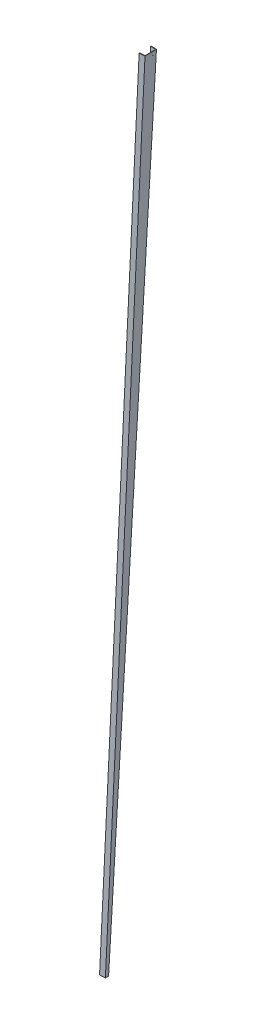
ISO-10303-21;
HEADER;
FILE_DESCRIPTION(('STEP AP214'),'2;1');
FILE_NAME('part.step','',(''),(''),'','','');
FILE_SCHEMA(('AUTOMOTIVE_DESIGN { 1 0 10303 214 1 1 1 1 }'));
ENDSEC;
DATA;
#1=APPLICATION_CONTEXT('core data for automotive mechanical design processes');
#2=APPLICATION_PROTOCOL_DEFINITION('international standard','automotive_design',2000,#1);
#3=PRODUCT_CONTEXT('',#1,'mechanical');
#4=PRODUCT('Part','Part','',(#3));
#5=PRODUCT_RELATED_PRODUCT_CATEGORY('part','',(#4));
#6=PRODUCT_DEFINITION_FORMATION('','',#4);
#7=PRODUCT_DEFINITION_CONTEXT('part definition',#1,'design');
#8=PRODUCT_DEFINITION('design','',#6,#7);
#9=PRODUCT_DEFINITION_SHAPE('','',#8);
#10=(LENGTH_UNIT() NAMED_UNIT(*) SI_UNIT(.MILLI.,.METRE.));
#11=(NAMED_UNIT(*) PLANE_ANGLE_UNIT() SI_UNIT($,.RADIAN.));
#12=(NAMED_UNIT(*) SI_UNIT($,.STERADIAN.) SOLID_ANGLE_UNIT());
#13=UNCERTAINTY_MEASURE_WITH_UNIT(LENGTH_MEASURE(1.E-05),#10,'distance_accuracy_value','');
#14=(GEOMETRIC_REPRESENTATION_CONTEXT(3) GLOBAL_UNCERTAINTY_ASSIGNED_CONTEXT((#13)) GLOBAL_UNIT_ASSIGNED_CONTEXT((#10,
#11,#12)) REPRESENTATION_CONTEXT('',''));
#15=CARTESIAN_POINT('',(0.,0.,0.));
#16=DIRECTION('',(0.,0.,1.));
#17=DIRECTION('',(1.,0.,0.));
#18=AXIS2_PLACEMENT_3D('',#15,#16,#17);
#19=CARTESIAN_POINT('',(2599.99999999952,-6.,170.586848034612));
#20=CARTESIAN_POINT('',(2534.2697041529,-6.,176.346834132));
#21=CARTESIAN_POINT('',(2334.95316217575,-6.,192.748824658086));
#22=CARTESIAN_POINT('',(2001.69070181506,-6.,214.463613492604));
#23=CARTESIAN_POINT('',(1599.37094286474,-6.,231.352561723895));
#24=CARTESIAN_POINT('',(1263.24435445069,-6.,232.556225070545));
#25=CARTESIAN_POINT('',(993.973907409277,-6.,222.12375768287));
#26=CARTESIAN_POINT('',(795.174235232141,-6.,208.219874651518));
#27=CARTESIAN_POINT('',(663.965855088083,-6.,194.360823975463));
#28=CARTESIAN_POINT('',(600.,-6.,186.18428191945));
#29=B_SPLINE_CURVE_WITH_KNOTS('',3,(#19,#20,#21,#22,#23,#24,#25,#26,#27,#28),.UNSPECIFIED.,.F.,
.F.,(4,1,1,1,1,1,1,4),(0.174597883746009,0.199092181037773,0.248838608700846,0.298568063520415,
0.348560819140765,0.373566506187247,0.398590699494546,0.422530238981498),.UNSPECIFIED.);
#30=DIRECTION('',(0.,1.,0.));
#31=VECTOR('',#30,1.);
#32=SURFACE_OF_LINEAR_EXTRUSION('',#29,#31);
#33=CARTESIAN_POINT('',(2599.99999999952,0.,170.586848034612));
#34=CARTESIAN_POINT('',(2534.2697041529,0.,176.346834132));
#35=CARTESIAN_POINT('',(2334.95316217575,0.,192.748824658086));
#36=CARTESIAN_POINT('',(2001.69070181506,0.,214.463613492604));
#37=CARTESIAN_POINT('',(1599.37094286474,0.,231.352561723895));
#38=CARTESIAN_POINT('',(1263.24435445069,0.,232.556225070545));
#39=CARTESIAN_POINT('',(993.973907409277,0.,222.12375768287));
#40=CARTESIAN_POINT('',(795.174235232141,0.,208.219874651518));
#41=CARTESIAN_POINT('',(663.965855088083,0.,194.360823975463));
#42=CARTESIAN_POINT('',(600.,0.,186.18428191945));
#43=B_SPLINE_CURVE_WITH_KNOTS('',3,(#33,#34,#35,#36,#37,#38,#39,#40,#41,#42),.UNSPECIFIED.,.F.,
.F.,(4,1,1,1,1,1,1,4),(0.174597883746009,0.199092181037773,0.248838608700846,0.298568063520415,
0.348560819140765,0.373566506187247,0.398590699494546,0.422530238981498),.UNSPECIFIED.);
#44=CARTESIAN_POINT('',(2599.99999999952,0.,170.586848034612));
#45=VERTEX_POINT('',#44);
#46=CARTESIAN_POINT('',(2500.35850650668,0.,179.046917450204));
#47=VERTEX_POINT('',#46);
#48=EDGE_CURVE('E269',#45,#47,#43,.T.);
#49=ORIENTED_EDGE('',*,*,#48,.T.);
#50=DIRECTION('',(0.,1.,0.));
#51=VECTOR('',#50,1.);
#52=CARTESIAN_POINT('',(2500.35850650668,-6.,179.046917450204));
#53=LINE('',#52,#51);
#54=CARTESIAN_POINT('',(2500.35850650668,-6.,179.046917450204));
#55=VERTEX_POINT('',#54);
#56=EDGE_CURVE('E12',#55,#47,#53,.T.);
#57=ORIENTED_EDGE('',*,*,#56,.F.);
#58=CARTESIAN_POINT('',(2599.99999999952,-6.,170.586848034612));
#59=CARTESIAN_POINT('',(2579.45955608785,-6.,172.386819719532));
#60=CARTESIAN_POINT('',(2546.2485958408,-6.,175.24168460526));
#61=CARTESIAN_POINT('',(2513.03004420894,-6.,178.005908476496));
#62=CARTESIAN_POINT('',(2500.35850650668,-6.,179.046917450204));
#63=B_SPLINE_CURVE_WITH_KNOTS('',3,(#58,#59,#60,#61,#62),.UNSPECIFIED.,.F.,.F.,(4,1,4),(0.,
0.618573156382193,1.),.UNSPECIFIED.);
#64=CARTESIAN_POINT('',(2599.99999999952,-6.,170.586848034612));
#65=VERTEX_POINT('',#64);
#66=EDGE_CURVE('E366',#65,#55,#63,.T.);
#67=ORIENTED_EDGE('',*,*,#66,.F.);
#68=DIRECTION('',(0.,1.,0.));
#69=VECTOR('',#68,1.);
#70=CARTESIAN_POINT('',(2599.99999999952,-6.,170.586848034612));
#71=LINE('',#70,#69);
#72=EDGE_CURVE('E504',#65,#45,#71,.T.);
#73=ORIENTED_EDGE('',*,*,#72,.T.);
#74=EDGE_LOOP('',(#49,#57,#67,#73));
#75=FACE_BOUND('',#74,.T.);
#76=ADVANCED_FACE('F83',(#75),#32,.F.);
#77=CARTESIAN_POINT('',(2468.98560541185,-6.,-202.835380486657));
#78=DIRECTION('',(0.996642401697206,0.,-0.0818774885986695));
#79=DIRECTION('',(-0.0818774885986695,0.,-0.996642401697206));
#80=AXIS2_PLACEMENT_3D('',#77,#78,#79);
#81=PLANE('',#80);
#82=DIRECTION('',(-0.0818774885986695,0.,-0.996642401697206));
#83=VECTOR('',#82,1.);
#84=CARTESIAN_POINT('',(2468.98560541185,0.,-202.835380486657));
#85=LINE('',#84,#83);
#86=CARTESIAN_POINT('',(2499.70348659789,0.,171.073778236626));
#87=VERTEX_POINT('',#86);
#88=EDGE_CURVE('E502',#47,#87,#85,.T.);
#89=ORIENTED_EDGE('',*,*,#88,.T.);
#90=DIRECTION('',(0.,1.,0.));
#91=VECTOR('',#90,1.);
#92=CARTESIAN_POINT('',(2499.70348659789,-6.,171.073778236626));
#93=LINE('',#92,#91);
#94=CARTESIAN_POINT('',(2499.7034865979,-5.99999999978938,171.073778236626));
#95=VERTEX_POINT('',#94);
#96=EDGE_CURVE('E94',#95,#87,#93,.T.);
#97=ORIENTED_EDGE('',*,*,#96,.F.);
#98=DIRECTION('',(-0.0818774885986695,0.,-0.996642401697206));
#99=VECTOR('',#98,1.);
#100=CARTESIAN_POINT('',(2468.98560541185,-6.,-202.835380486657));
#101=LINE('',#100,#99);
#102=EDGE_CURVE('E101',#55,#95,#101,.T.);
#103=ORIENTED_EDGE('',*,*,#102,.F.);
#104=ORIENTED_EDGE('',*,*,#56,.T.);
#105=EDGE_LOOP('',(#89,#97,#103,#104));
#106=FACE_BOUND('',#105,.T.);
#107=ADVANCED_FACE('F445',(#106),#81,.F.);
#108=CARTESIAN_POINT('',(32.1443860382321,-6.,379.874674155472));
#109=DIRECTION('',(0.0843170689465924,0.,0.996438975494363));
#110=DIRECTION('',(0.996438975494363,0.,-0.0843170689465924));
#111=AXIS2_PLACEMENT_3D('',#108,#109,#110);
#112=PLANE('',#111);
#113=DIRECTION('',(0.996438975494363,0.,-0.0843170689465924));
#114=VECTOR('',#113,1.);
#115=CARTESIAN_POINT('',(32.1443860382321,0.,379.874674155472));
#116=LINE('',#115,#114);
#117=CARTESIAN_POINT('',(2595.99999999952,0.,162.925321623141));
#118=VERTEX_POINT('',#117);
#119=EDGE_CURVE('E150',#87,#118,#116,.T.);
#120=ORIENTED_EDGE('',*,*,#119,.T.);
#121=DIRECTION('',(0.,1.,0.));
#122=VECTOR('',#121,1.);
#123=CARTESIAN_POINT('',(2595.99999999952,-6.,162.925321623141));
#124=LINE('',#123,#122);
#125=CARTESIAN_POINT('',(2595.99999999952,-6.00000000000006,162.925321623141));
#126=VERTEX_POINT('',#125);
#127=EDGE_CURVE('E143',#126,#118,#124,.T.);
#128=ORIENTED_EDGE('',*,*,#127,.F.);
#129=DIRECTION('',(0.996438975494363,0.,-0.0843170689465924));
#130=VECTOR('',#129,1.);
#131=CARTESIAN_POINT('',(32.1443860382321,-6.,379.874674155472));
#132=LINE('',#131,#130);
#133=EDGE_CURVE('E148',#95,#126,#132,.T.);
#134=ORIENTED_EDGE('',*,*,#133,.F.);
#135=ORIENTED_EDGE('',*,*,#96,.T.);
#136=EDGE_LOOP('',(#120,#128,#134,#135));
#137=FACE_BOUND('',#136,.T.);
#138=ADVANCED_FACE('F145',(#137),#112,.F.);
#139=CARTESIAN_POINT('',(2595.99999999952,-6.,0.));
#140=DIRECTION('',(-1.,0.,0.));
#141=DIRECTION('',(0.,0.,1.));
#142=AXIS2_PLACEMENT_3D('',#139,#140,#141);
#143=PLANE('',#142);
#144=DIRECTION('',(0.,0.,1.));
#145=VECTOR('',#144,1.);
#146=CARTESIAN_POINT('',(2595.99999999952,0.,0.));
#147=LINE('',#146,#145);
#148=CARTESIAN_POINT('',(2595.99999999952,0.,-32.0935332730472));
#149=VERTEX_POINT('',#148);
#150=EDGE_CURVE('E499',#149,#118,#147,.T.);
#151=ORIENTED_EDGE('',*,*,#150,.F.);
#152=DIRECTION('',(0.,1.,0.));
#153=VECTOR('',#152,1.);
#154=CARTESIAN_POINT('',(2595.99999999952,-6.,-32.0935332730472));
#155=LINE('',#154,#153);
#156=CARTESIAN_POINT('',(2595.99999999952,-6.00000000000006,-32.0935332730472));
#157=VERTEX_POINT('',#156);
#158=EDGE_CURVE('E154',#157,#149,#155,.T.);
#159=ORIENTED_EDGE('',*,*,#158,.F.);
#160=DIRECTION('',(0.,0.,1.));
#161=VECTOR('',#160,1.);
#162=CARTESIAN_POINT('',(2595.99999999952,-6.,0.));
#163=LINE('',#162,#161);
#164=EDGE_CURVE('E157',#157,#126,#163,.T.);
#165=ORIENTED_EDGE('',*,*,#164,.T.);
#166=ORIENTED_EDGE('',*,*,#127,.T.);
#167=EDGE_LOOP('',(#151,#159,#165,#166));
#168=FACE_BOUND('',#167,.T.);
#169=ADVANCED_FACE('F158',(#168),#143,.T.);
#170=CARTESIAN_POINT('',(3.75363334596203,-6.,-115.985953757026));
#171=DIRECTION('',(-0.0323458925706945,0.,0.999476734713623));
#172=DIRECTION('',(0.999476734713623,0.,0.0323458925706945));
#173=AXIS2_PLACEMENT_3D('',#170,#171,#172);
#174=PLANE('',#173);
#175=DIRECTION('',(0.999476734713623,0.,0.0323458925706945));
#176=VECTOR('',#175,1.);
#177=CARTESIAN_POINT('',(3.75363334596203,0.,-115.985953757026));
#178=LINE('',#177,#176);
#179=CARTESIAN_POINT('',(2499.7922733485,0.,-35.2070872785001));
#180=VERTEX_POINT('',#179);
#181=EDGE_CURVE('E496',#180,#149,#178,.T.);
#182=ORIENTED_EDGE('',*,*,#181,.F.);
#183=DIRECTION('',(0.,1.,0.));
#184=VECTOR('',#183,1.);
#185=CARTESIAN_POINT('',(2499.7922733485,-6.,-35.2070872785001));
#186=LINE('',#185,#184);
#187=CARTESIAN_POINT('',(2499.7922733485,-6.00000000000006,-35.2070872785001));
#188=VERTEX_POINT('',#187);
#189=EDGE_CURVE('E526',#188,#180,#186,.T.);
#190=ORIENTED_EDGE('',*,*,#189,.F.);
#191=DIRECTION('',(0.999476734713623,0.,0.0323458925706945));
#192=VECTOR('',#191,1.);
#193=CARTESIAN_POINT('',(3.75363334596203,-6.,-115.985953757026));
#194=LINE('',#193,#192);
#195=EDGE_CURVE('E164',#188,#157,#194,.T.);
#196=ORIENTED_EDGE('',*,*,#195,.T.);
#197=ORIENTED_EDGE('',*,*,#158,.T.);
#198=EDGE_LOOP('',(#182,#190,#196,#197));
#199=FACE_BOUND('',#198,.T.);
#200=ADVANCED_FACE('F452',(#199),#174,.T.);
#201=CARTESIAN_POINT('',(2496.00357952446,-6.,81.2219495049313));
#202=DIRECTION('',(-0.999470968324994,0.,-0.0325235833741888));
#203=DIRECTION('',(-0.0325235833741888,0.,0.999470968324995));
#204=AXIS2_PLACEMENT_3D('',#201,#202,#203);
#205=PLANE('',#204);
#206=DIRECTION('',(-0.0325235833741888,0.,0.999470968324995));
#207=VECTOR('',#206,1.);
#208=CARTESIAN_POINT('',(2496.00357952446,0.,81.2219495049313));
#209=LINE('',#208,#207);
#210=CARTESIAN_POINT('',(2500.05246201549,0.,-43.2028550251));
#211=VERTEX_POINT('',#210);
#212=EDGE_CURVE('E490',#211,#180,#209,.T.);
#213=ORIENTED_EDGE('',*,*,#212,.F.);
#214=DIRECTION('',(0.,1.,0.));
#215=VECTOR('',#214,1.);
#216=CARTESIAN_POINT('',(2500.05246201549,-6.,-43.2028550251));
#217=LINE('',#216,#215);
#218=CARTESIAN_POINT('',(2500.05246201549,-6.,-43.2028550251));
#219=VERTEX_POINT('',#218);
#220=EDGE_CURVE('E512',#219,#211,#217,.T.);
#221=ORIENTED_EDGE('',*,*,#220,.F.);
#222=DIRECTION('',(-0.0325235833741888,0.,0.999470968324995));
#223=VECTOR('',#222,1.);
#224=CARTESIAN_POINT('',(2496.00357952446,-6.,81.2219495049313));
#225=LINE('',#224,#223);
#226=EDGE_CURVE('E551',#219,#188,#225,.T.);
#227=ORIENTED_EDGE('',*,*,#226,.T.);
#228=ORIENTED_EDGE('',*,*,#189,.T.);
#229=EDGE_LOOP('',(#213,#221,#227,#228));
#230=FACE_BOUND('',#229,.T.);
#231=ADVANCED_FACE('F455',(#230),#205,.T.);
#232=CARTESIAN_POINT('',(600.,-6.,-89.4645917201508));
#233=CARTESIAN_POINT('',(602.959954579233,-6.,-89.484565354312));
#234=CARTESIAN_POINT('',(672.159470052365,-6.,-89.9158848258793));
#235=CARTESIAN_POINT('',(807.500107513008,-6.,-89.1942007038046));
#236=CARTESIAN_POINT('',(1005.86522896436,-6.,-85.7827057190728));
#237=CARTESIAN_POINT('',(1269.98342493216,-6.,-79.4685170149447));
#238=CARTESIAN_POINT('',(1600.82582994249,-6.,-70.868371473012));
#239=CARTESIAN_POINT('',(1998.59898384487,-6.,-59.7433814116752));
#240=CARTESIAN_POINT('',(2331.90774460215,-6.,-48.6742990755661));
#241=CARTESIAN_POINT('',(2532.42608256109,-6.,-42.1441188982458));
#242=CARTESIAN_POINT('',(2599.99999999952,-6.,-39.9640819653883));
#243=B_SPLINE_CURVE_WITH_KNOTS('',3,(#232,#233,#234,#235,#236,#237,#238,#239,#240,#241,#242),
.UNSPECIFIED.,.F.,.F.,(4,1,1,1,1,1,1,1,4),(0.579110380304788,0.580209466371041,
0.604805069213507,0.629344388861473,0.653862178346251,0.702881350286838,0.752206113639191,
0.801585908260931,0.826684648113707),.UNSPECIFIED.);
#244=DIRECTION('',(0.,1.,0.));
#245=VECTOR('',#244,1.);
#246=SURFACE_OF_LINEAR_EXTRUSION('',#243,#245);
#247=CARTESIAN_POINT('',(600.,0.,-89.4645917201508));
#248=CARTESIAN_POINT('',(602.959954579233,0.,-89.484565354312));
#249=CARTESIAN_POINT('',(672.159470052365,0.,-89.9158848258793));
#250=CARTESIAN_POINT('',(807.500107513008,0.,-89.1942007038046));
#251=CARTESIAN_POINT('',(1005.86522896436,0.,-85.7827057190728));
#252=CARTESIAN_POINT('',(1269.98342493216,0.,-79.4685170149447));
#253=CARTESIAN_POINT('',(1600.82582994249,0.,-70.868371473012));
#254=CARTESIAN_POINT('',(1998.59898384487,0.,-59.7433814116752));
#255=CARTESIAN_POINT('',(2331.90774460215,0.,-48.6742990755661));
#256=CARTESIAN_POINT('',(2532.42608256109,0.,-42.1441188982458));
#257=CARTESIAN_POINT('',(2599.99999999952,0.,-39.9640819653883));
#258=B_SPLINE_CURVE_WITH_KNOTS('',3,(#247,#248,#249,#250,#251,#252,#253,#254,#255,#256,#257),
.UNSPECIFIED.,.F.,.F.,(4,1,1,1,1,1,1,1,4),(0.579110380304788,0.580209466371041,
0.604805069213507,0.629344388861473,0.653862178346251,0.702881350286838,0.752206113639191,
0.801585908260931,0.826684648113707),.UNSPECIFIED.);
#259=CARTESIAN_POINT('',(2599.99999999952,0.,-39.9640819653883));
#260=VERTEX_POINT('',#259);
#261=EDGE_CURVE('E486',#211,#260,#258,.T.);
#262=ORIENTED_EDGE('',*,*,#261,.T.);
#263=DIRECTION('',(0.,1.,0.));
#264=VECTOR('',#263,1.);
#265=CARTESIAN_POINT('',(2599.99999999952,-6.,-39.9640819653883));
#266=LINE('',#265,#264);
#267=CARTESIAN_POINT('',(2599.99999999952,-6.,-39.9640819653883));
#268=VERTEX_POINT('',#267);
#269=EDGE_CURVE('E507',#268,#260,#266,.T.);
#270=ORIENTED_EDGE('',*,*,#269,.F.);
#271=CARTESIAN_POINT('',(2500.05246201549,-6.,-43.2028550251));
#272=CARTESIAN_POINT('',(2512.25149432873,-6.,-42.8058887728546));
#273=CARTESIAN_POINT('',(2545.567247093,-6.,-41.7233402587988));
#274=CARTESIAN_POINT('',(2578.88314290906,-6.,-40.6453437614804));
#275=CARTESIAN_POINT('',(2599.99999999952,-6.,-39.9640819653883));
#276=B_SPLINE_CURVE_WITH_KNOTS('',3,(#271,#272,#273,#274,#275),.UNSPECIFIED.,.F.,.F.,(4,1,4),
(0.,0.366164629042427,1.),.UNSPECIFIED.);
#277=EDGE_CURVE('E215',#219,#268,#276,.T.);
#278=ORIENTED_EDGE('',*,*,#277,.F.);
#279=ORIENTED_EDGE('',*,*,#220,.T.);
#280=EDGE_LOOP('',(#262,#270,#278,#279));
#281=FACE_BOUND('',#280,.T.);
#282=ADVANCED_FACE('F459',(#281),#246,.F.);
#283=CARTESIAN_POINT('',(2599.99999999952,-6.,0.));
#284=DIRECTION('',(-1.,0.,0.));
#285=DIRECTION('',(0.,0.,1.));
#286=AXIS2_PLACEMENT_3D('',#283,#284,#285);
#287=PLANE('',#286);
#288=DIRECTION('',(0.,0.,1.));
#289=VECTOR('',#288,1.);
#290=CARTESIAN_POINT('',(2599.99999999952,0.,0.));
#291=LINE('',#290,#289);
#292=EDGE_CURVE('E481',#260,#45,#291,.T.);
#293=ORIENTED_EDGE('',*,*,#292,.T.);
#294=ORIENTED_EDGE('',*,*,#72,.F.);
#295=DIRECTION('',(0.,0.,1.));
#296=VECTOR('',#295,1.);
#297=CARTESIAN_POINT('',(2599.99999999952,-6.00000000000005,8.35964451863072E-12));
#298=LINE('',#297,#296);
#299=EDGE_CURVE('E541',#268,#65,#298,.T.);
#300=ORIENTED_EDGE('',*,*,#299,.F.);
#301=ORIENTED_EDGE('',*,*,#269,.T.);
#302=EDGE_LOOP('',(#293,#294,#300,#301));
#303=FACE_BOUND('',#302,.T.);
#304=ADVANCED_FACE('F443',(#303),#287,.F.);
#305=CARTESIAN_POINT('',(0.,0.,0.));
#306=DIRECTION('',(0.,1.,0.));
#307=DIRECTION('',(0.,0.,1.));
#308=AXIS2_PLACEMENT_3D('',#305,#306,#307);
#309=PLANE('',#308);
#310=ORIENTED_EDGE('',*,*,#48,.F.);
#311=ORIENTED_EDGE('',*,*,#292,.F.);
#312=ORIENTED_EDGE('',*,*,#261,.F.);
#313=ORIENTED_EDGE('',*,*,#212,.T.);
#314=ORIENTED_EDGE('',*,*,#181,.T.);
#315=ORIENTED_EDGE('',*,*,#150,.T.);
#316=ORIENTED_EDGE('',*,*,#119,.F.);
#317=ORIENTED_EDGE('',*,*,#88,.F.);
#318=EDGE_LOOP('',(#310,#311,#312,#313,#314,#315,#316,#317));
#319=FACE_BOUND('',#318,.T.);
#320=ADVANCED_FACE('F434',(#319),#309,.T.);
#321=CARTESIAN_POINT('',(2595.99999999952,-6.,-32.0935332730472));
#322=CARTESIAN_POINT('',(1908.49999999952,-14994.,159.528330510804));
#323=CARTESIAN_POINT('',(2579.96537889102,-6.,-32.6124589406225));
#324=CARTESIAN_POINT('',(1892.46520057445,-14994.,159.005620610005));
#325=CARTESIAN_POINT('',(2563.93075778252,-6.,-33.1313846081979));
#326=CARTESIAN_POINT('',(1876.43040114939,-14994.,158.482910709207));
#327=CARTESIAN_POINT('',(2531.86151556551,-6.,-34.1692359433489));
#328=CARTESIAN_POINT('',(1844.36080229926,-14994.,157.437490907609));
#329=CARTESIAN_POINT('',(2515.82689445701,-6.,-34.6881616109244));
#330=CARTESIAN_POINT('',(1828.32600287419,-14994.,156.91478100681));
#331=CARTESIAN_POINT('',(2499.7922733485,-6.,-35.2070872785001));
#332=CARTESIAN_POINT('',(1812.29120344913,-14994.,156.392071106011));
#333=B_SPLINE_SURFACE_WITH_KNOTS('',3,1,((#321,#322),(#323,#324),(#325,#326),(#327,#328),(#329,
#330),(#331,#332)),.UNSPECIFIED.,.F.,.F.,.F.,(4,2,4),(2,2),(0.,0.5,1.),(0.,1.),.UNSPECIFIED.);
#334=DIRECTION('',(-0.0458181841514757,-0.998868182361997,0.0127690354335218));
#335=VECTOR('',#334,1.);
#336=CARTESIAN_POINT('',(2156.04173839881,-7500.,60.5924919137557));
#337=LINE('',#336,#335);
#338=CARTESIAN_POINT('',(1812.29120344912,-14994.,156.392071106011));
#339=VERTEX_POINT('',#338);
#340=EDGE_CURVE('E195',#188,#339,#337,.T.);
#341=DIRECTION('',(0.999469093024966,0.,0.0325811615485419));
#342=VECTOR('',#341,1.);
#343=CARTESIAN_POINT('',(-3.16892486646306,-14994.,97.2108516582289));
#344=LINE('',#343,#342);
#345=CARTESIAN_POINT('',(1908.49999999952,-14994.,159.528330510804));
#346=VERTEX_POINT('',#345);
#347=EDGE_CURVE('E713',#339,#346,#344,.T.);
#348=DIRECTION('',(0.045818112112874,0.998868166324009,-0.0127705484190929));
#349=VECTOR('',#348,1.);
#350=CARTESIAN_POINT('',(2252.24999999952,-7500.,63.7173986188785));
#351=LINE('',#350,#349);
#352=EDGE_CURVE('E193',#346,#157,#351,.T.);
#353=ORIENTED_EDGE('',*,*,#195,.F.);
#354=ORIENTED_EDGE('',*,*,#340,.T.);
#355=ORIENTED_EDGE('',*,*,#347,.T.);
#356=ORIENTED_EDGE('',*,*,#352,.T.);
#357=EDGE_LOOP('',(#353,#354,#355,#356));
#358=FACE_BOUND('',#357,.T.);
#359=ADVANCED_FACE('F442',(#358),#333,.T.);
#360=CARTESIAN_POINT('',(2499.7922733485,-6.,-35.2070872785001));
#361=CARTESIAN_POINT('',(1812.29120344912,-14994.,156.392071106011));
#362=CARTESIAN_POINT('',(2499.83563812633,-6.,-36.5397152362667));
#363=CARTESIAN_POINT('',(1812.33487440158,-14994.,155.059453146621));
#364=CARTESIAN_POINT('',(2499.87900290417,-6.,-37.8723431940333));
#365=CARTESIAN_POINT('',(1812.37854535403,-14994.,153.726835187231));
#366=CARTESIAN_POINT('',(2499.96573245983,-6.,-40.5375991095666));
#367=CARTESIAN_POINT('',(1812.46588725893,-14994.,151.06159926845));
#368=CARTESIAN_POINT('',(2500.00909723766,-6.,-41.8702270673333));
#369=CARTESIAN_POINT('',(1812.50955821138,-14994.,149.728981309059));
#370=CARTESIAN_POINT('',(2500.05246201549,-6.,-43.2028550251001));
#371=CARTESIAN_POINT('',(1812.55322916383,-14994.,148.396363349669));
#372=B_SPLINE_SURFACE_WITH_KNOTS('',3,1,((#360,#361),(#362,#363),(#364,#365),(#366,#367),(#368,
#369),(#370,#371)),.UNSPECIFIED.,.F.,.F.,.F.,(4,2,4),(2,2),(0.,0.5,1.),(0.,1.),.UNSPECIFIED.);
#373=DIRECTION('',(-0.0458180619769747,-0.99886818791413,0.01276903950252));
#374=VECTOR('',#373,1.);
#375=CARTESIAN_POINT('',(2156.30284558966,-7500.,52.5967541622845));
#376=LINE('',#375,#374);
#377=CARTESIAN_POINT('',(1812.55322916383,-14994.,148.396363349669));
#378=VERTEX_POINT('',#377);
#379=EDGE_CURVE('E201',#219,#378,#376,.T.);
#380=DIRECTION('',(-0.0327532143380993,0.,0.999463469542796));
#381=VECTOR('',#380,1.);
#382=CARTESIAN_POINT('',(1815.46662102093,-14994.,59.4942878594296));
#383=LINE('',#382,#381);
#384=EDGE_CURVE('E184',#378,#339,#383,.T.);
#385=ORIENTED_EDGE('',*,*,#226,.F.);
#386=ORIENTED_EDGE('',*,*,#379,.T.);
#387=ORIENTED_EDGE('',*,*,#384,.T.);
#388=ORIENTED_EDGE('',*,*,#340,.F.);
#389=EDGE_LOOP('',(#385,#386,#387,#388));
#390=FACE_BOUND('',#389,.T.);
#391=ADVANCED_FACE('F709',(#390),#372,.T.);
#392=CARTESIAN_POINT('',(2590.82397214279,-118.84117166054,0.));
#393=DIRECTION('',(-0.998949627447912,0.0458218487370189,0.));
#394=DIRECTION('',(-0.0458218487370189,-0.998949627447912,0.));
#395=AXIS2_PLACEMENT_3D('',#392,#393,#394);
#396=PLANE('',#395);
#397=CARTESIAN_POINT('',(2593.25069889619,-65.9367649729525,65.5757326642614));
#398=DIRECTION('',(-0.998949627447912,0.0458218487370185,0.));
#399=DIRECTION('',(-0.0458218487370185,-0.998949627447912,0.));
#400=AXIS2_PLACEMENT_3D('',#397,#398,#399);
#401=CIRCLE('',#400,1.99999999999999);
#402=CARTESIAN_POINT('',(2593.15905519872,-67.9346642278483,65.5757326642614));
#403=VERTEX_POINT('',#402);
#404=EDGE_CURVE('E948',#403,#403,#401,.T.);
#405=ORIENTED_EDGE('',*,*,#404,.F.);
#406=EDGE_LOOP('',(#405));
#407=FACE_BOUND('',#406,.T.);
#408=CARTESIAN_POINT('',(2593.25069889602,-65.936764976612,145.575732664261));
#409=DIRECTION('',(-0.998949627447912,0.0458218487370185,0.));
#410=DIRECTION('',(-0.0458218487370185,-0.998949627447912,0.));
#411=AXIS2_PLACEMENT_3D('',#408,#409,#410);
#412=CIRCLE('',#411,2.);
#413=CARTESIAN_POINT('',(2593.15905519855,-67.9346642315078,145.575732664261));
#414=VERTEX_POINT('',#413);
#415=EDGE_CURVE('E951',#414,#414,#412,.T.);
#416=ORIENTED_EDGE('',*,*,#415,.F.);
#417=EDGE_LOOP('',(#416));
#418=FACE_BOUND('',#417,.T.);
#419=CARTESIAN_POINT('',(2593.25069889611,-65.9367649747823,105.575732664261));
#420=DIRECTION('',(-0.998949627447912,0.0458218487370185,0.));
#421=DIRECTION('',(-0.0458218487370185,-0.998949627447912,0.));
#422=AXIS2_PLACEMENT_3D('',#419,#420,#421);
#423=CIRCLE('',#422,1.99999999999999);
#424=CARTESIAN_POINT('',(2593.15905519863,-67.9346642296781,105.575732664261));
#425=VERTEX_POINT('',#424);
#426=EDGE_CURVE('E957',#425,#425,#423,.T.);
#427=ORIENTED_EDGE('',*,*,#426,.F.);
#428=EDGE_LOOP('',(#427));
#429=FACE_BOUND('',#428,.T.);
#430=CARTESIAN_POINT('',(2593.25069889636,-65.936764969293,-14.4242673357386));
#431=DIRECTION('',(-0.998949627447912,0.0458218487370185,0.));
#432=DIRECTION('',(-0.0458218487370185,-0.998949627447912,0.));
#433=AXIS2_PLACEMENT_3D('',#430,#431,#432);
#434=CIRCLE('',#433,1.99999999999999);
#435=CARTESIAN_POINT('',(2593.15905519888,-67.9346642241888,-14.4242673357386));
#436=VERTEX_POINT('',#435);
#437=EDGE_CURVE('E961',#436,#436,#434,.T.);
#438=ORIENTED_EDGE('',*,*,#437,.F.);
#439=EDGE_LOOP('',(#438));
#440=FACE_BOUND('',#439,.T.);
#441=CARTESIAN_POINT('',(2593.25069889627,-65.9367649711228,25.5757326642614));
#442=DIRECTION('',(-0.998949627447912,0.0458218487370185,0.));
#443=DIRECTION('',(-0.0458218487370185,-0.998949627447912,0.));
#444=AXIS2_PLACEMENT_3D('',#441,#442,#443);
#445=CIRCLE('',#444,1.99999999999999);
#446=CARTESIAN_POINT('',(2593.1590551988,-67.9346642260186,25.5757326642614));
#447=VERTEX_POINT('',#446);
#448=EDGE_CURVE('E966',#447,#447,#445,.T.);
#449=ORIENTED_EDGE('',*,*,#448,.F.);
#450=EDGE_LOOP('',(#449));
#451=FACE_BOUND('',#450,.T.);
#452=ORIENTED_EDGE('',*,*,#352,.F.);
#453=DIRECTION('',(0.,0.,1.));
#454=VECTOR('',#453,1.);
#455=CARTESIAN_POINT('',(1908.49999999952,-14994.,0.));
#456=LINE('',#455,#454);
#457=CARTESIAN_POINT('',(1908.49999999952,-14994.,202.894849437581));
#458=VERTEX_POINT('',#457);
#459=EDGE_CURVE('E179',#346,#458,#456,.T.);
#460=ORIENTED_EDGE('',*,*,#459,.T.);
#461=DIRECTION('',(-0.0458216861454038,-0.998946082832454,0.00266395804929932));
#462=VECTOR('',#461,1.);
#463=CARTESIAN_POINT('',(2252.24999999952,-7500.,182.910085530361));
#464=LINE('',#463,#462);
#465=EDGE_CURVE('E172',#126,#458,#464,.T.);
#466=ORIENTED_EDGE('',*,*,#465,.F.);
#467=ORIENTED_EDGE('',*,*,#164,.F.);
#468=EDGE_LOOP('',(#452,#460,#466,#467));
#469=FACE_BOUND('',#468,.T.);
#470=ADVANCED_FACE('F177',(#407,#418,#429,#440,#451,#469),#396,.T.);
#471=CARTESIAN_POINT('',(2500.05246201549,-6.,-43.2028550251));
#472=CARTESIAN_POINT('',(1812.55322916383,-14994.,148.396363349669));
#473=CARTESIAN_POINT('',(2512.25149432873,-6.,-42.8058887728546));
#474=CARTESIAN_POINT('',(1824.75217267759,-14994.,148.796132449572));
#475=CARTESIAN_POINT('',(2545.567247093,-6.,-41.7233402587988));
#476=CARTESIAN_POINT('',(1858.06748925042,-14994.,149.892488396157));
#477=CARTESIAN_POINT('',(2578.88314290906,-6.,-40.6453437614804));
#478=CARTESIAN_POINT('',(1891.38315079996,-14994.,150.977462842374));
#479=CARTESIAN_POINT('',(2599.99999999952,-6.,-39.9640819653883));
#480=CARTESIAN_POINT('',(1912.49999999952,-14994.,151.658724384015));
#481=B_SPLINE_SURFACE_WITH_KNOTS('',3,1,((#471,#472),(#473,#474),(#475,#476),(#477,#478),(#479,
#480)),.UNSPECIFIED.,.F.,.F.,.F.,(4,1,4),(2,2),(0.,0.366164629042427,1.),(0.,1.),.UNSPECIFIED.);
#482=DIRECTION('',(-0.0458181120761184,-0.998868165522709,0.0127706112256833));
#483=VECTOR('',#482,1.);
#484=CARTESIAN_POINT('',(2256.24999999952,-7500.,55.8473212093134));
#485=LINE('',#484,#483);
#486=CARTESIAN_POINT('',(1912.49999999952,-14994.,151.658724384015));
#487=VERTEX_POINT('',#486);
#488=EDGE_CURVE('E206',#268,#487,#485,.T.);
#489=CARTESIAN_POINT('',(1287.49999999952,-14994.,136.18981508206));
#490=CARTESIAN_POINT('',(1288.42498580556,-14994.,136.18357332139));
#491=CARTESIAN_POINT('',(1310.04983439094,-14994.,136.048785986649));
#492=CARTESIAN_POINT('',(1352.34378359742,-14994.,136.27431227504));
#493=CARTESIAN_POINT('',(1414.33288405096,-14994.,137.340404458125));
#494=CARTESIAN_POINT('',(1496.86982029089,-14994.,139.313588428638));
#495=CARTESIAN_POINT('',(1600.2580718566,-14994.,142.001133911085));
#496=CARTESIAN_POINT('',(1724.56218245108,-14994.,145.477693305967));
#497=CARTESIAN_POINT('',(1828.72117018775,-14994.,148.936781536601));
#498=CARTESIAN_POINT('',(1891.38315079996,-14994.,150.977462842374));
#499=CARTESIAN_POINT('',(1912.49999999952,-14994.,151.658724384015));
#500=B_SPLINE_CURVE_WITH_KNOTS('',3,(#489,#490,#491,#492,#493,#494,#495,#496,#497,#498,#499),
.UNSPECIFIED.,.F.,.F.,(4,1,1,1,1,1,1,1,4),(0.579110380304753,0.580209466371041,
0.604805069213507,0.629344388861473,0.653862178346251,0.702881350286838,0.752206113639191,
0.801585908260931,0.826684648113766),.UNSPECIFIED.);
#501=EDGE_CURVE('E181',#378,#487,#500,.T.);
#502=ORIENTED_EDGE('',*,*,#277,.T.);
#503=ORIENTED_EDGE('',*,*,#488,.T.);
#504=ORIENTED_EDGE('',*,*,#501,.F.);
#505=ORIENTED_EDGE('',*,*,#379,.F.);
#506=EDGE_LOOP('',(#502,#503,#504,#505));
#507=FACE_BOUND('',#506,.T.);
#508=ADVANCED_FACE('F223',(#507),#481,.T.);
#509=CARTESIAN_POINT('',(2594.81557357551,-119.024266535439,8.35964451863072E-12));
#510=DIRECTION('',(-0.998949627447912,0.0458218487370189,0.));
#511=DIRECTION('',(-0.0458218487370189,-0.998949627447912,0.));
#512=AXIS2_PLACEMENT_3D('',#509,#510,#511);
#513=PLANE('',#512);
#514=CARTESIAN_POINT('',(2597.24230026351,-66.1198598448521,65.5757326642614));
#515=DIRECTION('',(-0.998949627447912,0.0458218487370189,0.));
#516=DIRECTION('',(-0.0458218487370189,-0.998949627447912,0.));
#517=AXIS2_PLACEMENT_3D('',#514,#515,#516);
#518=CIRCLE('',#517,1.99999999999995);
#519=CARTESIAN_POINT('',(2597.15065656603,-68.1177590997479,65.5757326642614));
#520=VERTEX_POINT('',#519);
#521=EDGE_CURVE('E88',#520,#520,#518,.T.);
#522=ORIENTED_EDGE('',*,*,#521,.T.);
#523=EDGE_LOOP('',(#522));
#524=FACE_BOUND('',#523,.T.);
#525=CARTESIAN_POINT('',(2597.24230026334,-66.1198598485116,145.575732664261));
#526=DIRECTION('',(-0.998949627447912,0.0458218487370189,0.));
#527=DIRECTION('',(-0.0458218487370189,-0.998949627447912,0.));
#528=AXIS2_PLACEMENT_3D('',#525,#526,#527);
#529=CIRCLE('',#528,1.99999999999995);
#530=CARTESIAN_POINT('',(2597.15065656587,-68.1177591034074,145.575732664261));
#531=VERTEX_POINT('',#530);
#532=EDGE_CURVE('E953',#531,#531,#529,.T.);
#533=ORIENTED_EDGE('',*,*,#532,.T.);
#534=EDGE_LOOP('',(#533));
#535=FACE_BOUND('',#534,.T.);
#536=CARTESIAN_POINT('',(2597.24230026342,-66.1198598466819,105.575732664261));
#537=DIRECTION('',(-0.998949627447912,0.0458218487370189,0.));
#538=DIRECTION('',(-0.0458218487370189,-0.998949627447912,0.));
#539=AXIS2_PLACEMENT_3D('',#536,#537,#538);
#540=CIRCLE('',#539,1.99999999999995);
#541=CARTESIAN_POINT('',(2597.15065656595,-68.1177591015776,105.575732664261));
#542=VERTEX_POINT('',#541);
#543=EDGE_CURVE('E960',#542,#542,#540,.T.);
#544=ORIENTED_EDGE('',*,*,#543,.T.);
#545=EDGE_LOOP('',(#544));
#546=FACE_BOUND('',#545,.T.);
#547=CARTESIAN_POINT('',(2597.24230026368,-66.1198598411926,-14.4242673357386));
#548=DIRECTION('',(-0.998949627447912,0.0458218487370189,0.));
#549=DIRECTION('',(-0.0458218487370189,-0.998949627447912,0.));
#550=AXIS2_PLACEMENT_3D('',#547,#548,#549);
#551=CIRCLE('',#550,1.99999999999995);
#552=CARTESIAN_POINT('',(2597.1506565662,-68.1177590960884,-14.4242673357386));
#553=VERTEX_POINT('',#552);
#554=EDGE_CURVE('E964',#553,#553,#551,.T.);
#555=ORIENTED_EDGE('',*,*,#554,.T.);
#556=EDGE_LOOP('',(#555));
#557=FACE_BOUND('',#556,.T.);
#558=CARTESIAN_POINT('',(2597.24230026359,-66.1198598430224,25.5757326642614));
#559=DIRECTION('',(-0.998949627447912,0.0458218487370189,0.));
#560=DIRECTION('',(-0.0458218487370189,-0.998949627447912,0.));
#561=AXIS2_PLACEMENT_3D('',#558,#559,#560);
#562=CIRCLE('',#561,1.99999999999995);
#563=CARTESIAN_POINT('',(2597.15065656612,-68.1177590979181,25.5757326642614));
#564=VERTEX_POINT('',#563);
#565=EDGE_CURVE('E322',#564,#564,#562,.T.);
#566=ORIENTED_EDGE('',*,*,#565,.T.);
#567=EDGE_LOOP('',(#566));
#568=FACE_BOUND('',#567,.T.);
#569=DIRECTION('',(-0.045821685945907,-0.998946078483278,0.00266559185833235));
#570=VECTOR('',#569,1.);
#571=CARTESIAN_POINT('',(2599.99999999952,-6.,170.586848034612));
#572=LINE('',#571,#570);
#573=CARTESIAN_POINT('',(1912.49999999952,-14994.,210.58088938802));
#574=VERTEX_POINT('',#573);
#575=EDGE_CURVE('E353',#65,#574,#572,.T.);
#576=ORIENTED_EDGE('',*,*,#575,.T.);
#577=DIRECTION('',(0.,0.,1.));
#578=VECTOR('',#577,1.);
#579=CARTESIAN_POINT('',(1912.49999999952,-14994.,6.16144758212891E-12));
#580=LINE('',#579,#578);
#581=EDGE_CURVE('E265',#487,#574,#580,.T.);
#582=ORIENTED_EDGE('',*,*,#581,.F.);
#583=ORIENTED_EDGE('',*,*,#488,.F.);
#584=ORIENTED_EDGE('',*,*,#299,.T.);
#585=EDGE_LOOP('',(#576,#582,#583,#584));
#586=FACE_BOUND('',#585,.T.);
#587=ADVANCED_FACE('F235',(#524,#535,#546,#557,#568,#586),#513,.F.);
#588=CARTESIAN_POINT('',(2599.99999999952,-6.,170.586848034612));
#589=CARTESIAN_POINT('',(1912.49999999952,-14994.,210.58088938802));
#590=CARTESIAN_POINT('',(2579.45955608785,-6.,172.386819719532));
#591=CARTESIAN_POINT('',(1891.95928254663,-14994.,212.380885063945));
#592=CARTESIAN_POINT('',(2546.2485958408,-6.,175.24168460526));
#593=CARTESIAN_POINT('',(1858.73733588258,-14994.,215.114757805311));
#594=CARTESIAN_POINT('',(2513.03004420894,-6.,178.005908476496));
#595=CARTESIAN_POINT('',(1825.49219795723,-14994.,217.546550706014));
#596=CARTESIAN_POINT('',(2500.35850650668,-6.,179.046917450204));
#597=CARTESIAN_POINT('',(1812.80851623938,-14994.,218.429969952309));
#598=B_SPLINE_SURFACE_WITH_KNOTS('',3,1,((#588,#589),(#590,#591),(#592,#593),(#594,#595),(#596,
#597)),.UNSPECIFIED.,.F.,.F.,.F.,(4,1,4),(2,2),(0.,0.618573156382193,1.),(0.,1.),.UNSPECIFIED.);
#599=DIRECTION('',(-0.045825015723355,-0.998946033574414,0.00262486950140319));
#600=VECTOR('',#599,1.);
#601=CARTESIAN_POINT('',(2156.58351137303,-7500.,198.738443701256));
#602=LINE('',#601,#600);
#603=CARTESIAN_POINT('',(1812.80851623939,-14994.,218.429969952308));
#604=VERTEX_POINT('',#603);
#605=EDGE_CURVE('E186',#55,#604,#602,.T.);
#606=CARTESIAN_POINT('',(1912.49999999952,-14994.,210.58088938802));
#607=CARTESIAN_POINT('',(1891.95928254663,-14994.,212.380885063945));
#608=CARTESIAN_POINT('',(1829.6728631809,-14994.,217.506507164999));
#609=CARTESIAN_POINT('',(1725.52834432162,-14994.,224.292378778609));
#610=CARTESIAN_POINT('',(1599.80341965386,-14994.,229.570175224803));
#611=CARTESIAN_POINT('',(1494.76386077401,-14994.,229.946320124127));
#612=CARTESIAN_POINT('',(1410.6168460697,-14994.,226.686174148361));
#613=CARTESIAN_POINT('',(1348.49194851201,-14994.,222.34121076241));
#614=CARTESIAN_POINT('',(1307.48932971482,-14994.,218.01025746685));
#615=CARTESIAN_POINT('',(1287.49999999952,-14994.,215.455088094436));
#616=B_SPLINE_CURVE_WITH_KNOTS('',3,(#606,#607,#608,#609,#610,#611,#612,#613,#614,#615),
.UNSPECIFIED.,.F.,.F.,(4,1,1,1,1,1,1,4),(0.174597883743107,0.199092181037773,0.248838608700846,
0.298568063520415,0.348560819140765,0.373566506187247,0.398590699494547,0.422530238978604),.UNSPECIFIED.);
#617=EDGE_CURVE('E270',#574,#604,#616,.T.);
#618=ORIENTED_EDGE('',*,*,#66,.T.);
#619=ORIENTED_EDGE('',*,*,#605,.T.);
#620=ORIENTED_EDGE('',*,*,#617,.F.);
#621=ORIENTED_EDGE('',*,*,#575,.F.);
#622=EDGE_LOOP('',(#618,#619,#620,#621));
#623=FACE_BOUND('',#622,.T.);
#624=ADVANCED_FACE('F372',(#623),#598,.T.);
#625=CARTESIAN_POINT('',(2500.35850650668,-6.,179.046917450204));
#626=CARTESIAN_POINT('',(1812.80851623939,-14994.,218.429969952308));
#627=CARTESIAN_POINT('',(2500.24933652188,-6.,177.718060914607));
#628=CARTESIAN_POINT('',(1812.71587392524,-14994.,217.099858987235));
#629=CARTESIAN_POINT('',(2500.14016653708,-6.,176.389204379011));
#630=CARTESIAN_POINT('',(1812.6232316111,-14994.,215.769748022162));
#631=CARTESIAN_POINT('',(2499.92182656749,-6.,173.731491307819));
#632=CARTESIAN_POINT('',(1812.4379469828,-14994.,213.109526092017));
#633=CARTESIAN_POINT('',(2499.81265658269,-6.,172.402634772222));
#634=CARTESIAN_POINT('',(1812.34530466865,-14994.,211.779415126944));
#635=CARTESIAN_POINT('',(2499.70348659789,-6.,171.073778236626));
#636=CARTESIAN_POINT('',(1812.25266235451,-14994.,210.449304161871));
#637=B_SPLINE_SURFACE_WITH_KNOTS('',3,1,((#625,#626),(#627,#628),(#629,#630),(#631,#632),(#633,
#634),(#635,#636)),.UNSPECIFIED.,.F.,.F.,.F.,(4,2,4),(2,2),(0.,0.5,1.),(0.,1.),.UNSPECIFIED.);
#638=DIRECTION('',(-0.0458184202720229,-0.998946337424056,0.00262436865540227));
#639=VECTOR('',#638,1.);
#640=CARTESIAN_POINT('',(2155.9780744762,-7500.,190.761541199248));
#641=LINE('',#640,#639);
#642=CARTESIAN_POINT('',(1812.25266235451,-14994.,210.449304161871));
#643=VERTEX_POINT('',#642);
#644=EDGE_CURVE('E174',#95,#643,#641,.T.);
#645=DIRECTION('',(-0.0694817356107211,0.,-0.997583223804672));
#646=VECTOR('',#645,1.);
#647=CARTESIAN_POINT('',(1788.91658529997,-14994.,-124.598155064588));
#648=LINE('',#647,#646);
#649=EDGE_CURVE('E407',#604,#643,#648,.T.);
#650=ORIENTED_EDGE('',*,*,#102,.T.);
#651=ORIENTED_EDGE('',*,*,#644,.T.);
#652=ORIENTED_EDGE('',*,*,#649,.F.);
#653=ORIENTED_EDGE('',*,*,#605,.F.);
#654=EDGE_LOOP('',(#650,#651,#652,#653));
#655=FACE_BOUND('',#654,.T.);
#656=ADVANCED_FACE('F383',(#655),#637,.T.);
#657=CARTESIAN_POINT('',(2499.70348659789,-6.,171.073778236626));
#658=CARTESIAN_POINT('',(1812.25266235451,-14994.,210.449304161871));
#659=CARTESIAN_POINT('',(2515.75290549816,-6.,169.715702134378));
#660=CARTESIAN_POINT('',(1828.29388529534,-14994.,209.190228374489));
#661=CARTESIAN_POINT('',(2531.80232439843,-6.,168.357626032131));
#662=CARTESIAN_POINT('',(1844.33510823618,-14994.,207.931152587108));
#663=CARTESIAN_POINT('',(2563.90116219898,-6.,165.641473827636));
#664=CARTESIAN_POINT('',(1876.41755411785,-14994.,205.413001012344));
#665=CARTESIAN_POINT('',(2579.95058109925,-6.,164.283397725388));
#666=CARTESIAN_POINT('',(1892.45877705868,-14994.,204.153925224963));
#667=CARTESIAN_POINT('',(2595.99999999952,-6.,162.925321623141));
#668=CARTESIAN_POINT('',(1908.49999999952,-14994.,202.894849437581));
#669=B_SPLINE_SURFACE_WITH_KNOTS('',3,1,((#657,#658),(#659,#660),(#661,#662),(#663,#664),(#665,
#666),(#667,#668)),.UNSPECIFIED.,.F.,.F.,.F.,(4,2,4),(2,2),(0.,0.5,1.),(0.,1.),.UNSPECIFIED.);
#670=DIRECTION('',(0.99693381905088,0.,-0.0782493478096035));
#671=VECTOR('',#670,1.);
#672=CARTESIAN_POINT('',(27.5133797446242,-14994.,350.533512567359));
#673=LINE('',#672,#671);
#674=EDGE_CURVE('E419',#643,#458,#673,.T.);
#675=ORIENTED_EDGE('',*,*,#133,.T.);
#676=ORIENTED_EDGE('',*,*,#465,.T.);
#677=ORIENTED_EDGE('',*,*,#674,.F.);
#678=ORIENTED_EDGE('',*,*,#644,.F.);
#679=EDGE_LOOP('',(#675,#676,#677,#678));
#680=FACE_BOUND('',#679,.T.);
#681=ADVANCED_FACE('F169',(#680),#669,.T.);
#682=CARTESIAN_POINT('',(1287.49999999952,-14994.,136.18981508206));
#683=CARTESIAN_POINT('',(1288.42498580556,-14994.,136.18357332139));
#684=CARTESIAN_POINT('',(1310.04983439094,-14994.,136.048785986649));
#685=CARTESIAN_POINT('',(1352.34378359742,-14994.,136.27431227504));
#686=CARTESIAN_POINT('',(1414.33288405096,-14994.,137.340404458125));
#687=CARTESIAN_POINT('',(1496.86982029089,-14994.,139.313588428638));
#688=CARTESIAN_POINT('',(1600.2580718566,-14994.,142.001133911085));
#689=CARTESIAN_POINT('',(1724.56218245108,-14994.,145.477693305967));
#690=CARTESIAN_POINT('',(1828.72117018775,-14994.,148.936781536601));
#691=CARTESIAN_POINT('',(1891.38315079996,-14994.,150.977462842374));
#692=CARTESIAN_POINT('',(1912.49999999952,-14994.,151.658724384015));
#693=B_SPLINE_CURVE_WITH_KNOTS('',3,(#682,#683,#684,#685,#686,#687,#688,#689,#690,#691,#692),
.UNSPECIFIED.,.F.,.F.,(4,1,1,1,1,1,1,1,4),(0.579110380304753,0.580209466371041,
0.604805069213507,0.629344388861473,0.653862178346251,0.702881350286838,0.752206113639191,
0.801585908260931,0.826684648113766),.UNSPECIFIED.);
#694=DIRECTION('',(0.,-1.,0.));
#695=VECTOR('',#694,1.);
#696=SURFACE_OF_LINEAR_EXTRUSION('',#693,#695);
#697=CARTESIAN_POINT('',(1287.49999999952,-15000.,136.18981508206));
#698=CARTESIAN_POINT('',(1288.42498580556,-15000.,136.18357332139));
#699=CARTESIAN_POINT('',(1310.04983439094,-15000.,136.048785986649));
#700=CARTESIAN_POINT('',(1352.34378359742,-15000.,136.27431227504));
#701=CARTESIAN_POINT('',(1414.33288405096,-15000.,137.340404458125));
#702=CARTESIAN_POINT('',(1496.86982029089,-15000.,139.313588428638));
#703=CARTESIAN_POINT('',(1600.2580718566,-15000.,142.001133911085));
#704=CARTESIAN_POINT('',(1724.56218245108,-15000.,145.477693305967));
#705=CARTESIAN_POINT('',(1828.72117018775,-15000.,148.936781536601));
#706=CARTESIAN_POINT('',(1891.38315079996,-15000.,150.977462842374));
#707=CARTESIAN_POINT('',(1912.49999999952,-15000.,151.658724384015));
#708=B_SPLINE_CURVE_WITH_KNOTS('',3,(#697,#698,#699,#700,#701,#702,#703,#704,#705,#706,#707),
.UNSPECIFIED.,.F.,.F.,(4,1,1,1,1,1,1,1,4),(0.579110380304753,0.580209466371041,
0.604805069213507,0.629344388861473,0.653862178346251,0.702881350286838,0.752206113639191,
0.801585908260931,0.826684648113766),.UNSPECIFIED.);
#709=CARTESIAN_POINT('',(1812.55322916383,-15000.,148.396363349669));
#710=VERTEX_POINT('',#709);
#711=CARTESIAN_POINT('',(1912.49999999952,-15000.,151.658724384015));
#712=VERTEX_POINT('',#711);
#713=EDGE_CURVE('E313',#710,#712,#708,.T.);
#714=ORIENTED_EDGE('',*,*,#713,.F.);
#715=DIRECTION('',(0.,-1.,0.));
#716=VECTOR('',#715,1.);
#717=CARTESIAN_POINT('',(1812.55322916383,-14994.,148.396363349669));
#718=LINE('',#717,#716);
#719=EDGE_CURVE('E196',#378,#710,#718,.T.);
#720=ORIENTED_EDGE('',*,*,#719,.F.);
#721=ORIENTED_EDGE('',*,*,#501,.T.);
#722=DIRECTION('',(0.,-1.,0.));
#723=VECTOR('',#722,1.);
#724=CARTESIAN_POINT('',(1912.49999999952,-14994.,151.658724384015));
#725=LINE('',#724,#723);
#726=EDGE_CURVE('E351',#487,#712,#725,.T.);
#727=ORIENTED_EDGE('',*,*,#726,.T.);
#728=EDGE_LOOP('',(#714,#720,#721,#727));
#729=FACE_BOUND('',#728,.T.);
#730=ADVANCED_FACE('F433',(#729),#696,.T.);
#731=CARTESIAN_POINT('',(1815.46662102093,-14994.,59.4942878594296));
#732=DIRECTION('',(0.999463469542795,0.,0.0327532143380993));
#733=DIRECTION('',(0.0327532143380993,0.,-0.999463469542796));
#734=AXIS2_PLACEMENT_3D('',#731,#732,#733);
#735=PLANE('',#734);
#736=DIRECTION('',(-0.0327532143380993,0.,0.999463469542796));
#737=VECTOR('',#736,1.);
#738=CARTESIAN_POINT('',(1815.46662102093,-15000.,59.4942878594296));
#739=LINE('',#738,#737);
#740=CARTESIAN_POINT('',(1812.29120344912,-15000.,156.392071106011));
#741=VERTEX_POINT('',#740);
#742=EDGE_CURVE('E321',#710,#741,#739,.T.);
#743=ORIENTED_EDGE('',*,*,#742,.T.);
#744=DIRECTION('',(0.,-1.,0.));
#745=VECTOR('',#744,1.);
#746=CARTESIAN_POINT('',(1812.29120344912,-14994.,156.392071106011));
#747=LINE('',#746,#745);
#748=EDGE_CURVE('E560',#339,#741,#747,.T.);
#749=ORIENTED_EDGE('',*,*,#748,.F.);
#750=ORIENTED_EDGE('',*,*,#384,.F.);
#751=ORIENTED_EDGE('',*,*,#719,.T.);
#752=EDGE_LOOP('',(#743,#749,#750,#751));
#753=FACE_BOUND('',#752,.T.);
#754=ADVANCED_FACE('F578',(#753),#735,.F.);
#755=CARTESIAN_POINT('',(-3.16892486646306,-14994.,97.2108516582289));
#756=DIRECTION('',(0.0325811615485419,0.,-0.999469093024966));
#757=DIRECTION('',(-0.999469093024966,0.,-0.0325811615485419));
#758=AXIS2_PLACEMENT_3D('',#755,#756,#757);
#759=PLANE('',#758);
#760=DIRECTION('',(0.999469093024966,0.,0.0325811615485419));
#761=VECTOR('',#760,1.);
#762=CARTESIAN_POINT('',(-3.16892486646306,-15000.,97.2108516582289));
#763=LINE('',#762,#761);
#764=CARTESIAN_POINT('',(1908.49999999952,-15000.,159.528330510804));
#765=VERTEX_POINT('',#764);
#766=EDGE_CURVE('E328',#741,#765,#763,.T.);
#767=ORIENTED_EDGE('',*,*,#766,.T.);
#768=DIRECTION('',(0.,-1.,0.));
#769=VECTOR('',#768,1.);
#770=CARTESIAN_POINT('',(1908.49999999952,-14994.,159.528330510804));
#771=LINE('',#770,#769);
#772=EDGE_CURVE('E563',#346,#765,#771,.T.);
#773=ORIENTED_EDGE('',*,*,#772,.F.);
#774=ORIENTED_EDGE('',*,*,#347,.F.);
#775=ORIENTED_EDGE('',*,*,#748,.T.);
#776=EDGE_LOOP('',(#767,#773,#774,#775));
#777=FACE_BOUND('',#776,.T.);
#778=ADVANCED_FACE('F588',(#777),#759,.F.);
#779=CARTESIAN_POINT('',(1908.49999999952,-14994.,0.));
#780=DIRECTION('',(1.,0.,0.));
#781=DIRECTION('',(0.,0.,-1.));
#782=AXIS2_PLACEMENT_3D('',#779,#780,#781);
#783=PLANE('',#782);
#784=DIRECTION('',(0.,0.,1.));
#785=VECTOR('',#784,1.);
#786=CARTESIAN_POINT('',(1908.49999999952,-15000.,0.));
#787=LINE('',#786,#785);
#788=CARTESIAN_POINT('',(1908.49999999952,-15000.,202.894849437581));
#789=VERTEX_POINT('',#788);
#790=EDGE_CURVE('E331',#765,#789,#787,.T.);
#791=ORIENTED_EDGE('',*,*,#790,.T.);
#792=DIRECTION('',(0.,-1.,0.));
#793=VECTOR('',#792,1.);
#794=CARTESIAN_POINT('',(1908.49999999952,-14994.,202.894849437581));
#795=LINE('',#794,#793);
#796=EDGE_CURVE('E634',#458,#789,#795,.T.);
#797=ORIENTED_EDGE('',*,*,#796,.F.);
#798=ORIENTED_EDGE('',*,*,#459,.F.);
#799=ORIENTED_EDGE('',*,*,#772,.T.);
#800=EDGE_LOOP('',(#791,#797,#798,#799));
#801=FACE_BOUND('',#800,.T.);
#802=ADVANCED_FACE('F675',(#801),#783,.F.);
#803=CARTESIAN_POINT('',(27.5133797446242,-14994.,350.533512567359));
#804=DIRECTION('',(-0.0782493478096035,0.,-0.996933819050879));
#805=DIRECTION('',(-0.99693381905088,0.,0.0782493478096035));
#806=AXIS2_PLACEMENT_3D('',#803,#804,#805);
#807=PLANE('',#806);
#808=DIRECTION('',(0.99693381905088,0.,-0.0782493478096035));
#809=VECTOR('',#808,1.);
#810=CARTESIAN_POINT('',(27.5133797446242,-15000.,350.533512567359));
#811=LINE('',#810,#809);
#812=CARTESIAN_POINT('',(1812.25266235451,-15000.,210.449304161871));
#813=VERTEX_POINT('',#812);
#814=EDGE_CURVE('E334',#813,#789,#811,.T.);
#815=ORIENTED_EDGE('',*,*,#814,.F.);
#816=DIRECTION('',(0.,-1.,0.));
#817=VECTOR('',#816,1.);
#818=CARTESIAN_POINT('',(1812.25266235451,-14994.,210.449304161871));
#819=LINE('',#818,#817);
#820=EDGE_CURVE('E629',#643,#813,#819,.T.);
#821=ORIENTED_EDGE('',*,*,#820,.F.);
#822=ORIENTED_EDGE('',*,*,#674,.T.);
#823=ORIENTED_EDGE('',*,*,#796,.T.);
#824=EDGE_LOOP('',(#815,#821,#822,#823));
#825=FACE_BOUND('',#824,.T.);
#826=ADVANCED_FACE('F683',(#825),#807,.T.);
#827=CARTESIAN_POINT('',(1788.91658529997,-14994.,-124.598155064588));
#828=DIRECTION('',(-0.997583223804672,0.,0.0694817356107211));
#829=DIRECTION('',(0.0694817356107211,0.,0.997583223804672));
#830=AXIS2_PLACEMENT_3D('',#827,#828,#829);
#831=PLANE('',#830);
#832=DIRECTION('',(-0.0694817356107211,0.,-0.997583223804672));
#833=VECTOR('',#832,1.);
#834=CARTESIAN_POINT('',(1788.91658529997,-15000.,-124.598155064588));
#835=LINE('',#834,#833);
#836=CARTESIAN_POINT('',(1812.80851623939,-15000.,218.429969952308));
#837=VERTEX_POINT('',#836);
#838=EDGE_CURVE('E337',#837,#813,#835,.T.);
#839=ORIENTED_EDGE('',*,*,#838,.F.);
#840=DIRECTION('',(0.,-1.,0.));
#841=VECTOR('',#840,1.);
#842=CARTESIAN_POINT('',(1812.80851623939,-14994.,218.429969952308));
#843=LINE('',#842,#841);
#844=EDGE_CURVE('E285',#604,#837,#843,.T.);
#845=ORIENTED_EDGE('',*,*,#844,.F.);
#846=ORIENTED_EDGE('',*,*,#649,.T.);
#847=ORIENTED_EDGE('',*,*,#820,.T.);
#848=EDGE_LOOP('',(#839,#845,#846,#847));
#849=FACE_BOUND('',#848,.T.);
#850=ADVANCED_FACE('F299',(#849),#831,.T.);
#851=CARTESIAN_POINT('',(1912.49999999952,-14994.,210.58088938802));
#852=CARTESIAN_POINT('',(1891.95928254663,-14994.,212.380885063945));
#853=CARTESIAN_POINT('',(1829.6728631809,-14994.,217.506507164999));
#854=CARTESIAN_POINT('',(1725.52834432162,-14994.,224.292378778609));
#855=CARTESIAN_POINT('',(1599.80341965386,-14994.,229.570175224803));
#856=CARTESIAN_POINT('',(1494.76386077401,-14994.,229.946320124127));
#857=CARTESIAN_POINT('',(1410.6168460697,-14994.,226.686174148361));
#858=CARTESIAN_POINT('',(1348.49194851201,-14994.,222.34121076241));
#859=CARTESIAN_POINT('',(1307.48932971482,-14994.,218.01025746685));
#860=CARTESIAN_POINT('',(1287.49999999952,-14994.,215.455088094436));
#861=B_SPLINE_CURVE_WITH_KNOTS('',3,(#851,#852,#853,#854,#855,#856,#857,#858,#859,#860),
.UNSPECIFIED.,.F.,.F.,(4,1,1,1,1,1,1,4),(0.174597883743107,0.199092181037773,0.248838608700846,
0.298568063520415,0.348560819140765,0.373566506187247,0.398590699494547,0.422530238978604),.UNSPECIFIED.);
#862=DIRECTION('',(0.,-1.,0.));
#863=VECTOR('',#862,1.);
#864=SURFACE_OF_LINEAR_EXTRUSION('',#861,#863);
#865=CARTESIAN_POINT('',(1912.49999999952,-15000.,210.58088938802));
#866=CARTESIAN_POINT('',(1891.95928254663,-15000.,212.380885063945));
#867=CARTESIAN_POINT('',(1829.6728631809,-15000.,217.506507164999));
#868=CARTESIAN_POINT('',(1725.52834432162,-15000.,224.292378778609));
#869=CARTESIAN_POINT('',(1599.80341965386,-15000.,229.570175224803));
#870=CARTESIAN_POINT('',(1494.76386077401,-15000.,229.946320124127));
#871=CARTESIAN_POINT('',(1410.6168460697,-15000.,226.686174148361));
#872=CARTESIAN_POINT('',(1348.49194851201,-15000.,222.34121076241));
#873=CARTESIAN_POINT('',(1307.48932971482,-15000.,218.01025746685));
#874=CARTESIAN_POINT('',(1287.49999999952,-15000.,215.455088094436));
#875=B_SPLINE_CURVE_WITH_KNOTS('',3,(#865,#866,#867,#868,#869,#870,#871,#872,#873,#874),
.UNSPECIFIED.,.F.,.F.,(4,1,1,1,1,1,1,4),(0.174597883743107,0.199092181037773,0.248838608700846,
0.298568063520415,0.348560819140765,0.373566506187247,0.398590699494547,0.422530238978604),.UNSPECIFIED.);
#876=CARTESIAN_POINT('',(1912.49999999952,-15000.,210.58088938802));
#877=VERTEX_POINT('',#876);
#878=EDGE_CURVE('E340',#877,#837,#875,.T.);
#879=ORIENTED_EDGE('',*,*,#878,.F.);
#880=DIRECTION('',(0.,-1.,0.));
#881=VECTOR('',#880,1.);
#882=CARTESIAN_POINT('',(1912.49999999952,-14994.,210.58088938802));
#883=LINE('',#882,#881);
#884=EDGE_CURVE('E611',#574,#877,#883,.T.);
#885=ORIENTED_EDGE('',*,*,#884,.F.);
#886=ORIENTED_EDGE('',*,*,#617,.T.);
#887=ORIENTED_EDGE('',*,*,#844,.T.);
#888=EDGE_LOOP('',(#879,#885,#886,#887));
#889=FACE_BOUND('',#888,.T.);
#890=ADVANCED_FACE('F287',(#889),#864,.T.);
#891=CARTESIAN_POINT('',(1912.49999999952,-14994.,6.16144758212891E-12));
#892=DIRECTION('',(1.,0.,0.));
#893=DIRECTION('',(0.,0.,-1.));
#894=AXIS2_PLACEMENT_3D('',#891,#892,#893);
#895=PLANE('',#894);
#896=DIRECTION('',(0.,0.,1.));
#897=VECTOR('',#896,1.);
#898=CARTESIAN_POINT('',(1912.49999999952,-15000.,6.16144758212891E-12));
#899=LINE('',#898,#897);
#900=EDGE_CURVE('E345',#712,#877,#899,.T.);
#901=ORIENTED_EDGE('',*,*,#900,.F.);
#902=ORIENTED_EDGE('',*,*,#726,.F.);
#903=ORIENTED_EDGE('',*,*,#581,.T.);
#904=ORIENTED_EDGE('',*,*,#884,.T.);
#905=EDGE_LOOP('',(#901,#902,#903,#904));
#906=FACE_BOUND('',#905,.T.);
#907=ADVANCED_FACE('F298',(#906),#895,.T.);
#908=CARTESIAN_POINT('',(0.,-15000.,0.));
#909=DIRECTION('',(0.,1.,0.));
#910=DIRECTION('',(0.,0.,1.));
#911=AXIS2_PLACEMENT_3D('',#908,#909,#910);
#912=PLANE('',#911);
#913=ORIENTED_EDGE('',*,*,#713,.T.);
#914=ORIENTED_EDGE('',*,*,#900,.T.);
#915=ORIENTED_EDGE('',*,*,#878,.T.);
#916=ORIENTED_EDGE('',*,*,#838,.T.);
#917=ORIENTED_EDGE('',*,*,#814,.T.);
#918=ORIENTED_EDGE('',*,*,#790,.F.);
#919=ORIENTED_EDGE('',*,*,#766,.F.);
#920=ORIENTED_EDGE('',*,*,#742,.F.);
#921=EDGE_LOOP('',(#913,#914,#915,#916,#917,#918,#919,#920));
#922=FACE_BOUND('',#921,.T.);
#923=ADVANCED_FACE('F845',(#922),#912,.F.);
#924=CARTESIAN_POINT('',(2593.25069889627,-65.9367649711228,25.5757326642614));
#925=DIRECTION('',(-0.998949627447912,0.0458218487370185,0.));
#926=DIRECTION('',(-0.0458218487370185,-0.998949627447912,0.));
#927=AXIS2_PLACEMENT_3D('',#924,#925,#926);
#928=CYLINDRICAL_SURFACE('',#927,1.99999999999995);
#929=ORIENTED_EDGE('',*,*,#448,.T.);
#930=EDGE_LOOP('',(#929));
#931=FACE_BOUND('',#930,.T.);
#932=ORIENTED_EDGE('',*,*,#565,.F.);
#933=EDGE_LOOP('',(#932));
#934=FACE_BOUND('',#933,.T.);
#935=ADVANCED_FACE('F851',(#931,#934),#928,.F.);
#936=CARTESIAN_POINT('',(2593.25069889636,-65.936764969293,-14.4242673357386));
#937=DIRECTION('',(-0.998949627447912,0.0458218487370185,0.));
#938=DIRECTION('',(-0.0458218487370185,-0.998949627447912,0.));
#939=AXIS2_PLACEMENT_3D('',#936,#937,#938);
#940=CYLINDRICAL_SURFACE('',#939,1.99999999999995);
#941=ORIENTED_EDGE('',*,*,#437,.T.);
#942=EDGE_LOOP('',(#941));
#943=FACE_BOUND('',#942,.T.);
#944=ORIENTED_EDGE('',*,*,#554,.F.);
#945=EDGE_LOOP('',(#944));
#946=FACE_BOUND('',#945,.T.);
#947=ADVANCED_FACE('F899',(#943,#946),#940,.F.);
#948=CARTESIAN_POINT('',(2593.25069889611,-65.9367649747823,105.575732664261));
#949=DIRECTION('',(-0.998949627447912,0.0458218487370185,0.));
#950=DIRECTION('',(-0.0458218487370185,-0.998949627447912,0.));
#951=AXIS2_PLACEMENT_3D('',#948,#949,#950);
#952=CYLINDRICAL_SURFACE('',#951,1.99999999999995);
#953=ORIENTED_EDGE('',*,*,#426,.T.);
#954=EDGE_LOOP('',(#953));
#955=FACE_BOUND('',#954,.T.);
#956=ORIENTED_EDGE('',*,*,#543,.F.);
#957=EDGE_LOOP('',(#956));
#958=FACE_BOUND('',#957,.T.);
#959=ADVANCED_FACE('F908',(#955,#958),#952,.F.);
#960=CARTESIAN_POINT('',(2593.25069889602,-65.936764976612,145.575732664261));
#961=DIRECTION('',(-0.998949627447912,0.0458218487370185,0.));
#962=DIRECTION('',(-0.0458218487370185,-0.998949627447912,0.));
#963=AXIS2_PLACEMENT_3D('',#960,#961,#962);
#964=CYLINDRICAL_SURFACE('',#963,1.99999999999995);
#965=ORIENTED_EDGE('',*,*,#415,.T.);
#966=EDGE_LOOP('',(#965));
#967=FACE_BOUND('',#966,.T.);
#968=ORIENTED_EDGE('',*,*,#532,.F.);
#969=EDGE_LOOP('',(#968));
#970=FACE_BOUND('',#969,.T.);
#971=ADVANCED_FACE('F917',(#967,#970),#964,.F.);
#972=CARTESIAN_POINT('',(2593.25069889619,-65.9367649729525,65.5757326642614));
#973=DIRECTION('',(-0.998949627447912,0.0458218487370185,0.));
#974=DIRECTION('',(-0.0458218487370185,-0.998949627447912,0.));
#975=AXIS2_PLACEMENT_3D('',#972,#973,#974);
#976=CYLINDRICAL_SURFACE('',#975,1.99999999999995);
#977=ORIENTED_EDGE('',*,*,#404,.T.);
#978=EDGE_LOOP('',(#977));
#979=FACE_BOUND('',#978,.T.);
#980=ORIENTED_EDGE('',*,*,#521,.F.);
#981=EDGE_LOOP('',(#980));
#982=FACE_BOUND('',#981,.T.);
#983=ADVANCED_FACE('F926',(#979,#982),#976,.F.);
#984=CLOSED_SHELL('',(#76,#107,#138,#169,#200,#231,#282,#304,#320,#359,#391,#470,#508,#587,#624,
#656,#681,#730,#754,#778,#802,#826,#850,#890,#907,#923,#935,#947,#959,#971,#983));
#985=MANIFOLD_SOLID_BREP('B2',#984);
#986=ADVANCED_BREP_SHAPE_REPRESENTATION('',(#18,#985),#14);
#987=SHAPE_DEFINITION_REPRESENTATION(#9,#986);
ENDSEC;
END-ISO-10303-21;
